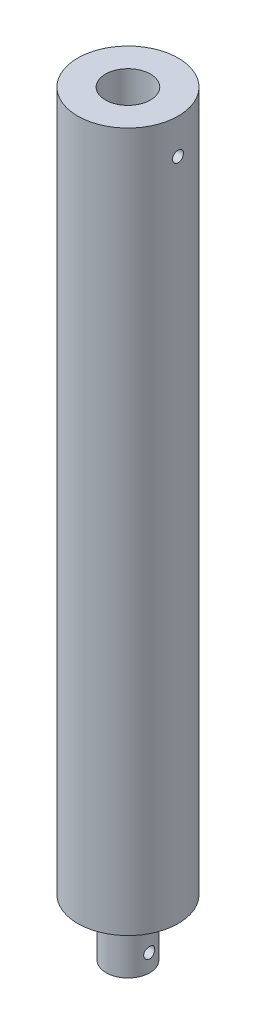
ISO-10303-21;
HEADER;
FILE_DESCRIPTION(('STEP AP214'),'2;1');
FILE_NAME('part.step','',(''),(''),'','','');
FILE_SCHEMA(('AUTOMOTIVE_DESIGN { 1 0 10303 214 1 1 1 1 }'));
ENDSEC;
DATA;
#1=APPLICATION_CONTEXT('core data for automotive mechanical design processes');
#2=APPLICATION_PROTOCOL_DEFINITION('international standard','automotive_design',2000,#1);
#3=PRODUCT_CONTEXT('',#1,'mechanical');
#4=PRODUCT('Part','Part','',(#3));
#5=PRODUCT_RELATED_PRODUCT_CATEGORY('part','',(#4));
#6=PRODUCT_DEFINITION_FORMATION('','',#4);
#7=PRODUCT_DEFINITION_CONTEXT('part definition',#1,'design');
#8=PRODUCT_DEFINITION('design','',#6,#7);
#9=PRODUCT_DEFINITION_SHAPE('','',#8);
#10=(LENGTH_UNIT() NAMED_UNIT(*) SI_UNIT(.MILLI.,.METRE.));
#11=(NAMED_UNIT(*) PLANE_ANGLE_UNIT() SI_UNIT($,.RADIAN.));
#12=(NAMED_UNIT(*) SI_UNIT($,.STERADIAN.) SOLID_ANGLE_UNIT());
#13=UNCERTAINTY_MEASURE_WITH_UNIT(LENGTH_MEASURE(1.E-05),#10,'distance_accuracy_value','');
#14=(GEOMETRIC_REPRESENTATION_CONTEXT(3) GLOBAL_UNCERTAINTY_ASSIGNED_CONTEXT((#13)) GLOBAL_UNIT_ASSIGNED_CONTEXT((#10,
#11,#12)) REPRESENTATION_CONTEXT('',''));
#15=CARTESIAN_POINT('',(0.,0.,0.));
#16=DIRECTION('',(0.,0.,1.));
#17=DIRECTION('',(1.,0.,0.));
#18=AXIS2_PLACEMENT_3D('',#15,#16,#17);
#19=CARTESIAN_POINT('',(0.,219.71,0.));
#20=DIRECTION('',(0.,-1.,0.));
#21=DIRECTION('',(0.,0.,-1.));
#22=AXIS2_PLACEMENT_3D('',#19,#20,#21);
#23=CYLINDRICAL_SURFACE('',#22,6.35);
#24=CARTESIAN_POINT('',(0.,16.51,0.));
#25=DIRECTION('',(0.,1.,0.));
#26=DIRECTION('',(0.,0.,1.));
#27=AXIS2_PLACEMENT_3D('',#24,#25,#26);
#28=CIRCLE('',#27,6.35);
#29=CARTESIAN_POINT('',(0.,16.51,6.35));
#30=VERTEX_POINT('',#29);
#31=EDGE_CURVE('E69',#30,#30,#28,.T.);
#32=ORIENTED_EDGE('',*,*,#31,.F.);
#33=EDGE_LOOP('',(#32));
#34=FACE_BOUND('',#33,.T.);
#35=CARTESIAN_POINT('',(0.,207.01,0.));
#36=DIRECTION('',(0.,1.,0.));
#37=DIRECTION('',(0.,0.,1.));
#38=AXIS2_PLACEMENT_3D('',#35,#36,#37);
#39=CIRCLE('',#38,6.35);
#40=CARTESIAN_POINT('',(0.,207.01,6.35));
#41=VERTEX_POINT('',#40);
#42=EDGE_CURVE('E58',#41,#41,#39,.T.);
#43=ORIENTED_EDGE('',*,*,#42,.T.);
#44=EDGE_LOOP('',(#43));
#45=FACE_BOUND('',#44,.T.);
#46=ADVANCED_FACE('F53',(#34,#45),#23,.F.);
#47=CARTESIAN_POINT('',(0.,219.71,0.));
#48=DIRECTION('',(0.,1.,0.));
#49=DIRECTION('',(0.,0.,1.));
#50=AXIS2_PLACEMENT_3D('',#47,#48,#49);
#51=PLANE('',#50);
#52=CARTESIAN_POINT('',(0.,219.71,0.));
#53=DIRECTION('',(0.,1.,0.));
#54=DIRECTION('',(0.,0.,1.));
#55=AXIS2_PLACEMENT_3D('',#52,#53,#54);
#56=CIRCLE('',#55,6.5405);
#57=CARTESIAN_POINT('',(0.,219.71,6.5405));
#58=VERTEX_POINT('',#57);
#59=EDGE_CURVE('E101',#58,#58,#56,.T.);
#60=ORIENTED_EDGE('',*,*,#59,.F.);
#61=EDGE_LOOP('',(#60));
#62=FACE_BOUND('',#61,.T.);
#63=CARTESIAN_POINT('',(0.,219.71,0.));
#64=DIRECTION('',(0.,1.,0.));
#65=DIRECTION('',(0.,0.,1.));
#66=AXIS2_PLACEMENT_3D('',#63,#64,#65);
#67=CIRCLE('',#66,14.605);
#68=CARTESIAN_POINT('',(0.,219.71,14.605));
#69=VERTEX_POINT('',#68);
#70=EDGE_CURVE('E11',#69,#69,#67,.T.);
#71=ORIENTED_EDGE('',*,*,#70,.T.);
#72=EDGE_LOOP('',(#71));
#73=FACE_BOUND('',#72,.T.);
#74=ADVANCED_FACE('F127',(#62,#73),#51,.T.);
#75=CARTESIAN_POINT('',(0.,16.51,0.));
#76=DIRECTION('',(0.,1.,0.));
#77=DIRECTION('',(0.,0.,1.));
#78=AXIS2_PLACEMENT_3D('',#75,#76,#77);
#79=PLANE('',#78);
#80=CARTESIAN_POINT('',(0.,16.51,0.));
#81=DIRECTION('',(0.,1.,0.));
#82=DIRECTION('',(0.,0.,1.));
#83=AXIS2_PLACEMENT_3D('',#80,#81,#82);
#84=CIRCLE('',#83,14.605);
#85=CARTESIAN_POINT('',(0.,16.51,14.605));
#86=VERTEX_POINT('',#85);
#87=EDGE_CURVE('E63',#86,#86,#84,.T.);
#88=ORIENTED_EDGE('',*,*,#87,.F.);
#89=EDGE_LOOP('',(#88));
#90=FACE_BOUND('',#89,.T.);
#91=ORIENTED_EDGE('',*,*,#31,.T.);
#92=EDGE_LOOP('',(#91));
#93=FACE_BOUND('',#92,.T.);
#94=ADVANCED_FACE('F123',(#90,#93),#79,.F.);
#95=CARTESIAN_POINT('',(0.,219.71,0.));
#96=DIRECTION('',(0.,-1.,0.));
#97=DIRECTION('',(0.,0.,-1.));
#98=AXIS2_PLACEMENT_3D('',#95,#96,#97);
#99=CYLINDRICAL_SURFACE('',#98,14.605);
#100=CARTESIAN_POINT('',(-14.5184664737706,209.55,-1.5875));
#101=CARTESIAN_POINT('',(-14.5184675998793,209.638887521639,-1.58749617103011));
#102=CARTESIAN_POINT('',(-14.5192915810766,209.727832779356,-1.58000933733849));
#103=CARTESIAN_POINT('',(-14.5224977657679,209.903254251712,-1.55025767880726));
#104=CARTESIAN_POINT('',(-14.5248816577369,209.989727684829,-1.52797684029079));
#105=CARTESIAN_POINT('',(-14.5309345224597,210.157639919113,-1.46929627189921));
#106=CARTESIAN_POINT('',(-14.5346026859705,210.23908185279,-1.43290543144579));
#107=CARTESIAN_POINT('',(-14.542809795843,210.394685284947,-1.34705560548717));
#108=CARTESIAN_POINT('',(-14.5473485770179,210.46884816049,-1.29759909832839));
#109=CARTESIAN_POINT('',(-14.55680721685,210.608121644079,-1.18679529511107));
#110=CARTESIAN_POINT('',(-14.561728458915,210.673196758916,-1.1254034998527));
#111=CARTESIAN_POINT('',(-14.5713850058503,210.792141514,-0.99256719274802));
#112=CARTESIAN_POINT('',(-14.5761203019701,210.846010627411,-0.921122208528099));
#113=CARTESIAN_POINT('',(-14.584885274292,210.941138656497,-0.769988010457059));
#114=CARTESIAN_POINT('',(-14.5889131672273,210.982365893287,-0.690278744826258));
#115=CARTESIAN_POINT('',(-14.5957943877229,211.050837145363,-0.525017488231168));
#116=CARTESIAN_POINT('',(-14.5986477487263,211.078081558793,-0.439465663705541));
#117=CARTESIAN_POINT('',(-14.6028486855217,211.117708966308,-0.26530816602213));
#118=CARTESIAN_POINT('',(-14.6042021952098,211.130150539723,-0.176715967283585));
#119=CARTESIAN_POINT('',(-14.6052711357852,211.140000446269,0.00130865260957029));
#120=CARTESIAN_POINT('',(-14.6049866162516,211.137409234405,0.0907410482517101));
#121=CARTESIAN_POINT('',(-14.602816394112,211.117314480232,0.267509453516736));
#122=CARTESIAN_POINT('',(-14.6009374553764,211.099873930969,0.354852718755758));
#123=CARTESIAN_POINT('',(-14.5957972349109,211.050673818854,0.52536510999851));
#124=CARTESIAN_POINT('',(-14.5925359324669,211.018914041435,0.608534173432904));
#125=CARTESIAN_POINT('',(-14.5849859179609,210.941908621576,0.768534715608067));
#126=CARTESIAN_POINT('',(-14.580695100976,210.896635302749,0.845352770841787));
#127=CARTESIAN_POINT('',(-14.5715670730655,210.793908049564,0.990324254080595));
#128=CARTESIAN_POINT('',(-14.5667298431935,210.736453692777,1.05847738146227));
#129=CARTESIAN_POINT('',(-14.557021832686,210.610641473295,1.18455371997678));
#130=CARTESIAN_POINT('',(-14.5521510078813,210.542228778665,1.24242222449574));
#131=CARTESIAN_POINT('',(-14.54294964144,210.39663140825,1.34586257686987));
#132=CARTESIAN_POINT('',(-14.5386191008396,210.319446715641,1.39143440114196));
#133=CARTESIAN_POINT('',(-14.5309883999937,210.158452137161,1.4689886011128));
#134=CARTESIAN_POINT('',(-14.5276885205374,210.074640453638,1.50096727440254));
#135=CARTESIAN_POINT('',(-14.5224984822577,209.902793238652,1.55038244591504));
#136=CARTESIAN_POINT('',(-14.5206082724931,209.814757859944,1.56781946963146));
#137=CARTESIAN_POINT('',(-14.5184605924623,209.637443455129,1.58758532851814));
#138=CARTESIAN_POINT('',(-14.5181948354549,209.548173073287,1.58999084458684));
#139=CARTESIAN_POINT('',(-14.5193042695985,209.370500534158,1.57982709014843));
#140=CARTESIAN_POINT('',(-14.5206794344695,209.28209836299,1.56725805946513));
#141=CARTESIAN_POINT('',(-14.5249082214811,209.10889719373,1.52756628881656));
#142=CARTESIAN_POINT('',(-14.5277581311357,209.024089723732,1.5004800879254));
#143=CARTESIAN_POINT('',(-14.5346122874711,208.860221443286,1.43256025639189));
#144=CARTESIAN_POINT('',(-14.5386165652124,208.78116078754,1.39172625583298));
#145=CARTESIAN_POINT('',(-14.5473482742757,208.630681695317,1.29727901083029));
#146=CARTESIAN_POINT('',(-14.5520785441031,208.559295211958,1.24361512329799));
#147=CARTESIAN_POINT('',(-14.5617200949785,208.426515536306,1.12510368818383));
#148=CARTESIAN_POINT('',(-14.5666313813248,208.36512263681,1.06025581304124));
#149=CARTESIAN_POINT('',(-14.5761067520141,208.253806819914,0.920883783286582));
#150=CARTESIAN_POINT('',(-14.5806692627852,208.203934044084,0.846319458816616));
#151=CARTESIAN_POINT('',(-14.5889099129678,208.117419830978,0.689828552404357));
#152=CARTESIAN_POINT('',(-14.5925880663857,208.080778184144,0.607902087091386));
#153=CARTESIAN_POINT('',(-14.5986385115443,208.02185061699,0.439184791888035));
#154=CARTESIAN_POINT('',(-14.6010135180575,207.999534835777,0.352404492790618));
#155=CARTESIAN_POINT('',(-14.6042012566077,207.969795102767,0.176301442814347));
#156=CARTESIAN_POINT('',(-14.6050140410925,207.96237065103,0.0869787773914742));
#157=CARTESIAN_POINT('',(-14.6049856599693,207.962632098322,-0.0911819181183822));
#158=CARTESIAN_POINT('',(-14.6041529956842,207.970240329941,-0.180020073683433));
#159=CARTESIAN_POINT('',(-14.6009440800001,208.000187782436,-0.355147937504436));
#160=CARTESIAN_POINT('',(-14.598567828036,208.022527008704,-0.441437644827324));
#161=CARTESIAN_POINT('',(-14.5925378101494,208.081279842982,-0.609015408924656));
#162=CARTESIAN_POINT('',(-14.5888842940992,208.117690698295,-0.690304440330071));
#163=CARTESIAN_POINT('',(-14.5807061313275,208.203545082923,-0.845629938613154));
#164=CARTESIAN_POINT('',(-14.5761814846426,208.252988611694,-0.919666405793615));
#165=CARTESIAN_POINT('',(-14.5667394117584,208.363795053645,-1.05878294429476));
#166=CARTESIAN_POINT('',(-14.5618201496834,208.42521583783,-1.12381679824635));
#167=CARTESIAN_POINT('',(-14.5521585816556,208.55811636505,-1.2426874668208));
#168=CARTESIAN_POINT('',(-14.5474163182489,208.629598507127,-1.29652160335967));
#169=CARTESIAN_POINT('',(-14.5386307131865,208.780828488436,-1.39159449332224));
#170=CARTESIAN_POINT('',(-14.5345894794341,208.860600141349,-1.43279553634583));
#171=CARTESIAN_POINT('',(-14.5276884225431,209.02592474979,-1.50116138037467));
#172=CARTESIAN_POINT('',(-14.5248272828866,209.11147113829,-1.5283418313459));
#173=CARTESIAN_POINT('',(-14.521323307398,209.256240851665,-1.56120374825235));
#174=CARTESIAN_POINT('',(-14.5202571468558,209.314542344085,-1.57105114201916));
#175=CARTESIAN_POINT('',(-14.5188283577012,209.431887394644,-1.5842005231171));
#176=CARTESIAN_POINT('',(-14.5184657254296,209.490930948922,-1.58750254449234));
#177=CARTESIAN_POINT('',(-14.5184664737706,209.55,-1.5875));
#178=B_SPLINE_CURVE_WITH_KNOTS('',3,(#100,#101,#102,#103,#104,#105,#106,#107,#108,#109,#110,
#111,#112,#113,#114,#115,#116,#117,#118,#119,#120,#121,#122,#123,#124,#125,#126,#127,#128,#129,
#130,#131,#132,#133,#134,#135,#136,#137,#138,#139,#140,#141,#142,#143,#144,#145,#146,#147,#148,
#149,#150,#151,#152,#153,#154,#155,#156,#157,#158,#159,#160,#161,#162,#163,#164,#165,#166,#167,
#168,#169,#170,#171,#172,#173,#174,#175,#176,#177),.UNSPECIFIED.,.T.,.F.,(4,2,2,2,2,2,2,2,2,2,2,
2,2,2,2,2,2,2,2,2,2,2,2,2,2,2,2,2,2,2,2,2,2,2,2,2,2,2,4),(0.,0.266446830712627,
0.533182546320062,0.799750488484646,1.06626790326574,1.33379874049426,1.60134215251234,
1.8695506153514,2.13775144084305,2.40488734623244,2.67201516612435,2.93801540493284,
3.20401962977065,3.47057242641525,3.73713446839447,4.00507454565817,4.27301513678461,
4.54102866103599,4.80903249962478,5.07566803460735,5.34229929936453,5.60826259513497,
5.87423304783905,6.14127121549871,6.40831720559882,6.67650449231114,6.94468753121167,
7.21230973751576,7.4799229588938,7.7461571530428,8.01239144466702,8.27857368179043,
8.5447559078008,8.81225763486746,9.07982325379274,9.34817996344659,9.61623647814001,
9.79330118896204,9.9703649788239),.UNSPECIFIED.);
#179=CARTESIAN_POINT('',(-14.5184664737706,209.55,-1.5875));
#180=VERTEX_POINT('',#179);
#181=EDGE_CURVE('E111',#180,#180,#178,.T.);
#182=ORIENTED_EDGE('',*,*,#181,.T.);
#183=EDGE_LOOP('',(#182));
#184=FACE_BOUND('',#183,.T.);
#185=CARTESIAN_POINT('',(14.5184664737706,209.55,-1.5875));
#186=CARTESIAN_POINT('',(14.5184675998793,209.461112478361,-1.58749617103011));
#187=CARTESIAN_POINT('',(14.5192915810766,209.372167220644,-1.58000933733849));
#188=CARTESIAN_POINT('',(14.5224977657679,209.196745748288,-1.55025767880726));
#189=CARTESIAN_POINT('',(14.5248816577369,209.110272315171,-1.52797684029079));
#190=CARTESIAN_POINT('',(14.5309345224597,208.942360080887,-1.46929627189921));
#191=CARTESIAN_POINT('',(14.5346026859705,208.86091814721,-1.43290543144579));
#192=CARTESIAN_POINT('',(14.542809795843,208.705314715053,-1.34705560548717));
#193=CARTESIAN_POINT('',(14.5473485770179,208.63115183951,-1.29759909832839));
#194=CARTESIAN_POINT('',(14.55680721685,208.491878355921,-1.18679529511107));
#195=CARTESIAN_POINT('',(14.561728458915,208.426803241084,-1.1254034998527));
#196=CARTESIAN_POINT('',(14.5713850058503,208.307858486,-0.99256719274802));
#197=CARTESIAN_POINT('',(14.5761203019701,208.253989372589,-0.921122208528099));
#198=CARTESIAN_POINT('',(14.584885274292,208.158861343503,-0.769988010457059));
#199=CARTESIAN_POINT('',(14.5889131672273,208.117634106713,-0.690278744826258));
#200=CARTESIAN_POINT('',(14.5957943877229,208.049162854637,-0.525017488231168));
#201=CARTESIAN_POINT('',(14.5986477487263,208.021918441207,-0.439465663705541));
#202=CARTESIAN_POINT('',(14.6028486855217,207.982291033692,-0.26530816602213));
#203=CARTESIAN_POINT('',(14.6042021952098,207.969849460277,-0.176715967283585));
#204=CARTESIAN_POINT('',(14.6052711357852,207.959999553731,0.00130865260957025));
#205=CARTESIAN_POINT('',(14.6049866162516,207.962590765595,0.0907410482517099));
#206=CARTESIAN_POINT('',(14.602816394112,207.982685519768,0.267509453516736));
#207=CARTESIAN_POINT('',(14.6009374553764,208.000126069031,0.354852718755758));
#208=CARTESIAN_POINT('',(14.5957972349109,208.049326181146,0.525365109998509));
#209=CARTESIAN_POINT('',(14.5925359324669,208.081085958565,0.608534173432901));
#210=CARTESIAN_POINT('',(14.5849859179609,208.158091378424,0.768534715608062));
#211=CARTESIAN_POINT('',(14.580695100976,208.203364697251,0.845352770841781));
#212=CARTESIAN_POINT('',(14.5715670730655,208.306091950436,0.99032425408059));
#213=CARTESIAN_POINT('',(14.5667298431935,208.363546307223,1.05847738146227));
#214=CARTESIAN_POINT('',(14.557021832686,208.489358526705,1.18455371997678));
#215=CARTESIAN_POINT('',(14.5521510078813,208.557771221335,1.24242222449574));
#216=CARTESIAN_POINT('',(14.54294964144,208.70336859175,1.34586257686987));
#217=CARTESIAN_POINT('',(14.5386191008396,208.780553284359,1.39143440114196));
#218=CARTESIAN_POINT('',(14.5309883999937,208.941547862839,1.4689886011128));
#219=CARTESIAN_POINT('',(14.5276885205374,209.025359546362,1.50096727440254));
#220=CARTESIAN_POINT('',(14.5224984822577,209.197206761348,1.55038244591504));
#221=CARTESIAN_POINT('',(14.5206082724931,209.285242140056,1.56781946963146));
#222=CARTESIAN_POINT('',(14.5184605924623,209.462556544871,1.58758532851814));
#223=CARTESIAN_POINT('',(14.5181948354549,209.551826926713,1.58999084458684));
#224=CARTESIAN_POINT('',(14.5193042695985,209.729499465842,1.57982709014843));
#225=CARTESIAN_POINT('',(14.5206794344695,209.81790163701,1.56725805946513));
#226=CARTESIAN_POINT('',(14.5249082214811,209.99110280627,1.52756628881656));
#227=CARTESIAN_POINT('',(14.5277581311357,210.075910276268,1.5004800879254));
#228=CARTESIAN_POINT('',(14.5346122874711,210.239778556714,1.43256025639189));
#229=CARTESIAN_POINT('',(14.5386165652124,210.31883921246,1.39172625583298));
#230=CARTESIAN_POINT('',(14.5473482742757,210.469318304683,1.29727901083029));
#231=CARTESIAN_POINT('',(14.5520785441031,210.540704788042,1.24361512329799));
#232=CARTESIAN_POINT('',(14.5617200949785,210.673484463694,1.12510368818383));
#233=CARTESIAN_POINT('',(14.5666313813248,210.73487736319,1.06025581304124));
#234=CARTESIAN_POINT('',(14.5761067520141,210.846193180086,0.920883783286582));
#235=CARTESIAN_POINT('',(14.5806692627852,210.896065955916,0.846319458816616));
#236=CARTESIAN_POINT('',(14.5889099129678,210.982580169022,0.689828552404357));
#237=CARTESIAN_POINT('',(14.5925880663857,211.019221815856,0.607902087091386));
#238=CARTESIAN_POINT('',(14.5986385115443,211.07814938301,0.439184791888035));
#239=CARTESIAN_POINT('',(14.6010135180575,211.100465164223,0.352404492790618));
#240=CARTESIAN_POINT('',(14.6042012566077,211.130204897233,0.176301442814347));
#241=CARTESIAN_POINT('',(14.6050140410925,211.13762934897,0.0869787773914742));
#242=CARTESIAN_POINT('',(14.6049856599693,211.137367901678,-0.0911819181183806));
#243=CARTESIAN_POINT('',(14.6041529956842,211.129759670059,-0.18002007368343));
#244=CARTESIAN_POINT('',(14.6009440800001,211.099812217564,-0.355147937504433));
#245=CARTESIAN_POINT('',(14.598567828036,211.077472991296,-0.441437644827323));
#246=CARTESIAN_POINT('',(14.5925378101494,211.018720157018,-0.609015408924656));
#247=CARTESIAN_POINT('',(14.5888842940992,210.982309301705,-0.690304440330071));
#248=CARTESIAN_POINT('',(14.5807061313275,210.896454917077,-0.845629938613154));
#249=CARTESIAN_POINT('',(14.5761814846426,210.847011388306,-0.919666405793615));
#250=CARTESIAN_POINT('',(14.5667394117584,210.736204946355,-1.05878294429476));
#251=CARTESIAN_POINT('',(14.5618201496834,210.67478416217,-1.12381679824635));
#252=CARTESIAN_POINT('',(14.5521585816556,210.54188363495,-1.2426874668208));
#253=CARTESIAN_POINT('',(14.5474163182489,210.470401492873,-1.29652160335967));
#254=CARTESIAN_POINT('',(14.5386307131865,210.319171511564,-1.39159449332224));
#255=CARTESIAN_POINT('',(14.5345894794341,210.239399858651,-1.43279553634583));
#256=CARTESIAN_POINT('',(14.5276884225431,210.07407525021,-1.50116138037467));
#257=CARTESIAN_POINT('',(14.5248272828866,209.98852886171,-1.5283418313459));
#258=CARTESIAN_POINT('',(14.521323307398,209.843759148335,-1.56120374825235));
#259=CARTESIAN_POINT('',(14.5202571468558,209.785457655915,-1.57105114201916));
#260=CARTESIAN_POINT('',(14.5188283577012,209.668112605356,-1.5842005231171));
#261=CARTESIAN_POINT('',(14.5184657254296,209.609069051078,-1.58750254449234));
#262=CARTESIAN_POINT('',(14.5184664737706,209.55,-1.5875));
#263=B_SPLINE_CURVE_WITH_KNOTS('',3,(#185,#186,#187,#188,#189,#190,#191,#192,#193,#194,#195,
#196,#197,#198,#199,#200,#201,#202,#203,#204,#205,#206,#207,#208,#209,#210,#211,#212,#213,#214,
#215,#216,#217,#218,#219,#220,#221,#222,#223,#224,#225,#226,#227,#228,#229,#230,#231,#232,#233,
#234,#235,#236,#237,#238,#239,#240,#241,#242,#243,#244,#245,#246,#247,#248,#249,#250,#251,#252,
#253,#254,#255,#256,#257,#258,#259,#260,#261,#262),.UNSPECIFIED.,.T.,.F.,(4,2,2,2,2,2,2,2,2,2,2,
2,2,2,2,2,2,2,2,2,2,2,2,2,2,2,2,2,2,2,2,2,2,2,2,2,2,2,4),(0.,0.266446830712627,
0.533182546320062,0.799750488484646,1.06626790326574,1.33379874049426,1.60134215251234,
1.8695506153514,2.13775144084305,2.40488734623244,2.67201516612435,2.93801540493284,
3.20401962977065,3.47057242641522,3.73713446839447,4.00507454565818,4.27301513678462,
4.54102866103599,4.80903249962478,5.07566803460735,5.34229929936454,5.60826259513498,
5.87423304783906,6.14127121549872,6.40831720559882,6.67650449231114,6.94468753121167,
7.21230973751577,7.47992295889381,7.7461571530428,8.01239144466703,8.27857368179043,
8.54475590780081,8.81225763486746,9.07982325379274,9.3481799634466,9.61623647814002,
9.79330118896205,9.9703649788239),.UNSPECIFIED.);
#264=CARTESIAN_POINT('',(14.5184664737706,209.55,-1.5875));
#265=VERTEX_POINT('',#264);
#266=EDGE_CURVE('E105',#265,#265,#263,.T.);
#267=ORIENTED_EDGE('',*,*,#266,.T.);
#268=EDGE_LOOP('',(#267));
#269=FACE_BOUND('',#268,.T.);
#270=ORIENTED_EDGE('',*,*,#70,.F.);
#271=EDGE_LOOP('',(#270));
#272=FACE_BOUND('',#271,.T.);
#273=ORIENTED_EDGE('',*,*,#87,.T.);
#274=EDGE_LOOP('',(#273));
#275=FACE_BOUND('',#274,.T.);
#276=ADVANCED_FACE('F55',(#184,#269,#272,#275),#99,.T.);
#277=CARTESIAN_POINT('',(-63.5,209.55,0.));
#278=DIRECTION('',(1.,0.,0.));
#279=DIRECTION('',(0.,0.,-1.));
#280=AXIS2_PLACEMENT_3D('',#277,#278,#279);
#281=CYLINDRICAL_SURFACE('',#280,1.5875);
#282=CARTESIAN_POINT('',(6.34491796637277,209.55,-1.5875));
#283=CARTESIAN_POINT('',(6.34491968426215,209.462250418049,-1.58749736582176));
#284=CARTESIAN_POINT('',(6.34675818545379,209.374471109173,-1.58019964378954));
#285=CARTESIAN_POINT('',(6.35389606992141,209.201427245727,-1.55124450799291));
#286=CARTESIAN_POINT('',(6.35919758521759,209.116164274171,-1.52957824804809));
#287=CARTESIAN_POINT('',(6.3726264991804,208.950681085134,-1.47262369396549));
#288=CARTESIAN_POINT('',(6.38075038324258,208.870454741727,-1.43735233582011));
#289=CARTESIAN_POINT('',(6.39890434246095,208.717050991301,-1.35423969965635));
#290=CARTESIAN_POINT('',(6.40893446978645,208.643873777284,-1.30639807760619));
#291=CARTESIAN_POINT('',(6.43000370261571,208.505126662975,-1.19844290464628));
#292=CARTESIAN_POINT('',(6.44105816656693,208.439724576003,-1.13811663163123));
#293=CARTESIAN_POINT('',(6.46279699070492,208.319860520756,-1.00736305385818));
#294=CARTESIAN_POINT('',(6.47348131771514,208.265399531077,-0.936934846525218));
#295=CARTESIAN_POINT('',(6.49344532758343,208.168282560192,-0.78683286056766));
#296=CARTESIAN_POINT('',(6.50270477206622,208.125790602063,-0.707050033574555));
#297=CARTESIAN_POINT('',(6.51860093249478,208.054883063351,-0.541212259787292));
#298=CARTESIAN_POINT('',(6.52523801253089,208.02646552853,-0.455158185662566));
#299=CARTESIAN_POINT('',(6.53503306133231,207.985048665064,-0.280969126711216));
#300=CARTESIAN_POINT('',(6.53825520282505,207.971764580376,-0.192905518803896));
#301=CARTESIAN_POINT('',(6.5410806397788,207.960098730191,-0.0157447093415772));
#302=CARTESIAN_POINT('',(6.54068444075277,207.961714883003,0.0733523460949865));
#303=CARTESIAN_POINT('',(6.53636591929678,207.979597048975,0.248078892603539));
#304=CARTESIAN_POINT('',(6.53251755422849,207.995555807196,0.333741930831281));
#305=CARTESIAN_POINT('',(6.52181275452451,208.041177340433,0.501136019120046));
#306=CARTESIAN_POINT('',(6.5149561650891,208.070840820682,0.582866866594928));
#307=CARTESIAN_POINT('',(6.49889076514058,208.143283935197,0.740896576460433));
#308=CARTESIAN_POINT('',(6.48966215073987,208.186174636569,0.817142428184156));
#309=CARTESIAN_POINT('',(6.46985647375277,208.283770805931,0.961463212608684));
#310=CARTESIAN_POINT('',(6.45927918882689,208.338478223038,1.02953679444236));
#311=CARTESIAN_POINT('',(6.43761262363987,208.459808438668,1.15741212795568));
#312=CARTESIAN_POINT('',(6.426517166513,208.526699877619,1.21695820454058));
#313=CARTESIAN_POINT('',(6.40531341859812,208.669635193443,1.3240425507407));
#314=CARTESIAN_POINT('',(6.39520516869336,208.745679449071,1.37158032318482));
#315=CARTESIAN_POINT('',(6.37709947532691,208.90524155167,1.45344979831044));
#316=CARTESIAN_POINT('',(6.36911139524974,208.988790439153,1.48772321635922));
#317=CARTESIAN_POINT('',(6.3562725519524,209.160704124048,1.54166028793874));
#318=CARTESIAN_POINT('',(6.35142116082779,209.249067953759,1.56132686559363));
#319=CARTESIAN_POINT('',(6.34553590723494,209.425740572472,1.58507460902303));
#320=CARTESIAN_POINT('',(6.3444098145259,209.513995724498,1.58953240019138));
#321=CARTESIAN_POINT('',(6.34585215226824,209.689988657294,1.58376434744586));
#322=CARTESIAN_POINT('',(6.34842026419646,209.777726482015,1.57353976948111));
#323=CARTESIAN_POINT('',(6.35687357701847,209.948817238501,1.53902664430697));
#324=CARTESIAN_POINT('',(6.36270771294604,210.032216575918,1.51495445136047));
#325=CARTESIAN_POINT('',(6.37698782066368,210.193796870487,1.45366790909821));
#326=CARTESIAN_POINT('',(6.38543408795636,210.271977236016,1.41645207281369));
#327=CARTESIAN_POINT('',(6.4041830163888,210.422504453987,1.32913633879426));
#328=CARTESIAN_POINT('',(6.41451729459556,210.494715697914,1.27880959655778));
#329=CARTESIAN_POINT('',(6.43579888617834,210.629806454802,1.16698987474897));
#330=CARTESIAN_POINT('',(6.44674629407724,210.692684523434,1.10549517017699));
#331=CARTESIAN_POINT('',(6.46833115043487,210.80883405371,0.971362469742996));
#332=CARTESIAN_POINT('',(6.47895532436956,210.861845877609,0.898497120590317));
#333=CARTESIAN_POINT('',(6.49843012874109,210.954879577056,0.744679012434444));
#334=CARTESIAN_POINT('',(6.50728085004527,210.994902118208,0.663726668107649));
#335=CARTESIAN_POINT('',(6.52215672044328,211.060484046306,0.496582797237446));
#336=CARTESIAN_POINT('',(6.5282016741717,211.086145078034,0.410432997983773));
#337=CARTESIAN_POINT('',(6.53687137211406,211.12258419647,0.234878786376294));
#338=CARTESIAN_POINT('',(6.53949673609309,211.13336498009,0.145474966800018));
#339=CARTESIAN_POINT('',(6.54100782326866,211.139593201496,-0.0316042892463484));
#340=CARTESIAN_POINT('',(6.53998725177793,211.135424841019,-0.11926562410486));
#341=CARTESIAN_POINT('',(6.53452721881309,211.112748064253,-0.292598866388573));
#342=CARTESIAN_POINT('',(6.53008784853861,211.094240030488,-0.378270826819382));
#343=CARTESIAN_POINT('',(6.51830173154418,211.043610310629,-0.544816635103991));
#344=CARTESIAN_POINT('',(6.51096906335874,211.01155449394,-0.625711568103395));
#345=CARTESIAN_POINT('',(6.49417098749026,210.934799619526,-0.781019842409194));
#346=CARTESIAN_POINT('',(6.48470532490558,210.890099050538,-0.855432407570926));
#347=CARTESIAN_POINT('',(6.4643954358641,210.788132029945,-0.997498614622161));
#348=CARTESIAN_POINT('',(6.45352471633866,210.730602508537,-1.06495965860988));
#349=CARTESIAN_POINT('',(6.43175445646956,210.60512631161,-1.18940092556251));
#350=CARTESIAN_POINT('',(6.42085490960104,210.537177035814,-1.24637852452788));
#351=CARTESIAN_POINT('',(6.40004729489635,210.391373925444,-1.34920016385311));
#352=CARTESIAN_POINT('',(6.39015966145724,210.313368969927,-1.39483435234641));
#353=CARTESIAN_POINT('',(6.37276546182382,210.150567131864,-1.47227278311196));
#354=CARTESIAN_POINT('',(6.36525709359829,210.06577545078,-1.50408749891636));
#355=CARTESIAN_POINT('',(6.35469845938995,209.909225552083,-1.54801336418728));
#356=CARTESIAN_POINT('',(6.35105754916475,209.838243137801,-1.56278956227978));
#357=CARTESIAN_POINT('',(6.34616668330979,209.694847162309,-1.58253359950715));
#358=CARTESIAN_POINT('',(6.34491654832501,209.622433708866,-1.58750217440693));
#359=CARTESIAN_POINT('',(6.34491796637277,209.55,-1.5875));
#360=B_SPLINE_CURVE_WITH_KNOTS('',3,(#282,#283,#284,#285,#286,#287,#288,#289,#290,#291,#292,
#293,#294,#295,#296,#297,#298,#299,#300,#301,#302,#303,#304,#305,#306,#307,#308,#309,#310,#311,
#312,#313,#314,#315,#316,#317,#318,#319,#320,#321,#322,#323,#324,#325,#326,#327,#328,#329,#330,
#331,#332,#333,#334,#335,#336,#337,#338,#339,#340,#341,#342,#343,#344,#345,#346,#347,#348,#349,
#350,#351,#352,#353,#354,#355,#356,#357,#358,#359),.UNSPECIFIED.,.T.,.F.,(4,2,2,2,2,2,2,2,2,2,2,
2,2,2,2,2,2,2,2,2,2,2,2,2,2,2,2,2,2,2,2,2,2,2,2,2,2,2,4),(0.,0.262982884455417,
0.526127828297949,0.788946253902493,1.05177187325518,1.31951149860587,1.58727506053874,
1.85854696084727,2.12978118438829,2.39582281056006,2.66182726902078,2.92226560284842,
3.18271734010051,3.44541851044345,3.70816304538045,3.97761827090134,4.24708465065347,
4.51772199622688,4.78830514865251,5.05213703166142,5.31594616781777,5.57574137420007,
5.83556598119524,6.10022504644799,6.36492502567164,6.63582770751486,6.90671650541965,
7.17566300176579,7.44456074756932,7.70659775158444,7.96862776576136,8.2293981844021,
8.49019978272768,8.75694282270458,9.0237525377354,9.29518189787864,9.56640518609354,
9.78350314217006,10.0005848110047),.UNSPECIFIED.);
#361=CARTESIAN_POINT('',(6.34491796637277,209.55,-1.5875));
#362=VERTEX_POINT('',#361);
#363=EDGE_CURVE('E81',#362,#362,#360,.T.);
#364=ORIENTED_EDGE('',*,*,#363,.T.);
#365=EDGE_LOOP('',(#364));
#366=FACE_BOUND('',#365,.T.);
#367=ORIENTED_EDGE('',*,*,#266,.F.);
#368=EDGE_LOOP('',(#367));
#369=FACE_BOUND('',#368,.T.);
#370=ADVANCED_FACE('F140',(#366,#369),#281,.F.);
#371=CARTESIAN_POINT('',(-6.34491796637277,209.55,-1.5875));
#372=CARTESIAN_POINT('',(-6.34491968426215,209.637749581951,-1.58749736582176));
#373=CARTESIAN_POINT('',(-6.34675818545379,209.725528890827,-1.58019964378954));
#374=CARTESIAN_POINT('',(-6.35389606992141,209.898572754273,-1.55124450799291));
#375=CARTESIAN_POINT('',(-6.35919758521759,209.983835725829,-1.52957824804809));
#376=CARTESIAN_POINT('',(-6.3726264991804,210.149318914866,-1.47262369396549));
#377=CARTESIAN_POINT('',(-6.38075038324258,210.229545258273,-1.43735233582011));
#378=CARTESIAN_POINT('',(-6.39890434246095,210.382949008699,-1.35423969965635));
#379=CARTESIAN_POINT('',(-6.40893446978645,210.456126222716,-1.30639807760619));
#380=CARTESIAN_POINT('',(-6.43000370261571,210.594873337025,-1.19844290464628));
#381=CARTESIAN_POINT('',(-6.44105816656693,210.660275423997,-1.13811663163123));
#382=CARTESIAN_POINT('',(-6.46279699070492,210.780139479244,-1.00736305385818));
#383=CARTESIAN_POINT('',(-6.47348131771514,210.834600468923,-0.936934846525218));
#384=CARTESIAN_POINT('',(-6.49344532758343,210.931717439808,-0.78683286056766));
#385=CARTESIAN_POINT('',(-6.50270477206622,210.974209397937,-0.707050033574555));
#386=CARTESIAN_POINT('',(-6.51860093249478,211.045116936649,-0.541212259787292));
#387=CARTESIAN_POINT('',(-6.52523801253089,211.07353447147,-0.455158185662566));
#388=CARTESIAN_POINT('',(-6.53503306133231,211.114951334936,-0.280969126711216));
#389=CARTESIAN_POINT('',(-6.53825520282505,211.128235419624,-0.192905518803896));
#390=CARTESIAN_POINT('',(-6.5410806397788,211.139901269809,-0.0157447093415772));
#391=CARTESIAN_POINT('',(-6.54068444075277,211.138285116997,0.0733523460949863));
#392=CARTESIAN_POINT('',(-6.53636591929678,211.120402951025,0.248078892603539));
#393=CARTESIAN_POINT('',(-6.53251755422849,211.104444192804,0.333741930831282));
#394=CARTESIAN_POINT('',(-6.52181275452451,211.058822659567,0.501136019120046));
#395=CARTESIAN_POINT('',(-6.5149561650891,211.029159179318,0.582866866594926));
#396=CARTESIAN_POINT('',(-6.49889076514058,210.956716064803,0.740896576460428));
#397=CARTESIAN_POINT('',(-6.48966215073987,210.913825363431,0.81714242818415));
#398=CARTESIAN_POINT('',(-6.46985647375277,210.816229194069,0.961463212608679));
#399=CARTESIAN_POINT('',(-6.45927918882689,210.761521776962,1.02953679444236));
#400=CARTESIAN_POINT('',(-6.43761262363987,210.640191561332,1.15741212795567));
#401=CARTESIAN_POINT('',(-6.426517166513,210.573300122381,1.21695820454058));
#402=CARTESIAN_POINT('',(-6.40531341859812,210.430364806557,1.3240425507407));
#403=CARTESIAN_POINT('',(-6.39520516869336,210.354320550929,1.37158032318482));
#404=CARTESIAN_POINT('',(-6.37709947532691,210.19475844833,1.45344979831044));
#405=CARTESIAN_POINT('',(-6.36911139524974,210.111209560847,1.48772321635922));
#406=CARTESIAN_POINT('',(-6.3562725519524,209.939295875952,1.54166028793874));
#407=CARTESIAN_POINT('',(-6.35142116082779,209.850932046241,1.56132686559363));
#408=CARTESIAN_POINT('',(-6.34553590723494,209.674259427528,1.58507460902303));
#409=CARTESIAN_POINT('',(-6.3444098145259,209.586004275502,1.58953240019138));
#410=CARTESIAN_POINT('',(-6.34585215226824,209.410011342706,1.58376434744586));
#411=CARTESIAN_POINT('',(-6.34842026419646,209.322273517985,1.57353976948111));
#412=CARTESIAN_POINT('',(-6.35687357701847,209.151182761499,1.53902664430697));
#413=CARTESIAN_POINT('',(-6.36270771294604,209.067783424082,1.51495445136046));
#414=CARTESIAN_POINT('',(-6.37698782066368,208.906203129513,1.4536679090982));
#415=CARTESIAN_POINT('',(-6.38543408795636,208.828022763984,1.41645207281368));
#416=CARTESIAN_POINT('',(-6.4041830163888,208.677495546013,1.32913633879426));
#417=CARTESIAN_POINT('',(-6.41451729459556,208.605284302086,1.27880959655778));
#418=CARTESIAN_POINT('',(-6.43579888617834,208.470193545198,1.16698987474897));
#419=CARTESIAN_POINT('',(-6.44674629407724,208.407315476566,1.10549517017699));
#420=CARTESIAN_POINT('',(-6.46833115043487,208.29116594629,0.971362469742996));
#421=CARTESIAN_POINT('',(-6.47895532436956,208.23815412239,0.898497120590317));
#422=CARTESIAN_POINT('',(-6.49843012874109,208.145120422944,0.744679012434444));
#423=CARTESIAN_POINT('',(-6.50728085004527,208.105097881792,0.663726668107649));
#424=CARTESIAN_POINT('',(-6.52215672044328,208.039515953694,0.496582797237444));
#425=CARTESIAN_POINT('',(-6.5282016741717,208.013854921966,0.410432997983769));
#426=CARTESIAN_POINT('',(-6.53687137211406,207.97741580353,0.23487878637629));
#427=CARTESIAN_POINT('',(-6.53949673609309,207.96663501991,0.145474966800016));
#428=CARTESIAN_POINT('',(-6.54100782326866,207.960406798504,-0.0316042892463483));
#429=CARTESIAN_POINT('',(-6.53998725177793,207.964575158981,-0.11926562410486));
#430=CARTESIAN_POINT('',(-6.53452721881309,207.987251935747,-0.292598866388573));
#431=CARTESIAN_POINT('',(-6.53008784853861,208.005759969512,-0.378270826819382));
#432=CARTESIAN_POINT('',(-6.51830173154418,208.056389689371,-0.544816635103991));
#433=CARTESIAN_POINT('',(-6.51096906335874,208.08844550606,-0.625711568103395));
#434=CARTESIAN_POINT('',(-6.49417098749026,208.165200380474,-0.781019842409194));
#435=CARTESIAN_POINT('',(-6.48470532490558,208.209900949462,-0.855432407570926));
#436=CARTESIAN_POINT('',(-6.4643954358641,208.311867970055,-0.997498614622161));
#437=CARTESIAN_POINT('',(-6.45352471633866,208.369397491463,-1.06495965860988));
#438=CARTESIAN_POINT('',(-6.43175445646956,208.49487368839,-1.18940092556251));
#439=CARTESIAN_POINT('',(-6.42085490960104,208.562822964186,-1.24637852452788));
#440=CARTESIAN_POINT('',(-6.40004729489635,208.708626074556,-1.34920016385311));
#441=CARTESIAN_POINT('',(-6.39015966145724,208.786631030073,-1.3948343523464));
#442=CARTESIAN_POINT('',(-6.37276546182382,208.949432868136,-1.47227278311195));
#443=CARTESIAN_POINT('',(-6.36525709359829,209.03422454922,-1.50408749891636));
#444=CARTESIAN_POINT('',(-6.35469845938995,209.190774447917,-1.54801336418728));
#445=CARTESIAN_POINT('',(-6.35105754916475,209.261756862199,-1.56278956227978));
#446=CARTESIAN_POINT('',(-6.34616668330979,209.405152837691,-1.58253359950715));
#447=CARTESIAN_POINT('',(-6.34491654832501,209.477566291134,-1.58750217440693));
#448=CARTESIAN_POINT('',(-6.34491796637277,209.55,-1.5875));
#449=B_SPLINE_CURVE_WITH_KNOTS('',3,(#371,#372,#373,#374,#375,#376,#377,#378,#379,#380,#381,
#382,#383,#384,#385,#386,#387,#388,#389,#390,#391,#392,#393,#394,#395,#396,#397,#398,#399,#400,
#401,#402,#403,#404,#405,#406,#407,#408,#409,#410,#411,#412,#413,#414,#415,#416,#417,#418,#419,
#420,#421,#422,#423,#424,#425,#426,#427,#428,#429,#430,#431,#432,#433,#434,#435,#436,#437,#438,
#439,#440,#441,#442,#443,#444,#445,#446,#447,#448),.UNSPECIFIED.,.T.,.F.,(4,2,2,2,2,2,2,2,2,2,2,
2,2,2,2,2,2,2,2,2,2,2,2,2,2,2,2,2,2,2,2,2,2,2,2,2,2,2,4),(0.,0.262982884455417,
0.526127828297949,0.788946253902493,1.05177187325518,1.31951149860587,1.58727506053874,
1.85854696084727,2.12978118438829,2.39582281056006,2.66182726902078,2.92226560284842,
3.18271734010051,3.44541851044343,3.70816304538045,3.97761827090134,4.24708465065348,
4.51772199622688,4.78830514865251,5.05213703166142,5.31594616781777,5.5757413742001,
5.83556598119525,6.10022504644799,6.36492502567164,6.63582770751486,6.90671650541965,
7.1756630017658,7.44456074756932,7.70659775158444,7.96862776576136,8.22939818440211,
8.49019978272768,8.75694282270458,9.0237525377354,9.29518189787861,9.56640518609354,
9.78350314217006,10.0005848110047),.UNSPECIFIED.);
#450=CARTESIAN_POINT('',(-6.34491796637277,209.55,-1.5875));
#451=VERTEX_POINT('',#450);
#452=EDGE_CURVE('E73',#451,#451,#449,.T.);
#453=ORIENTED_EDGE('',*,*,#452,.T.);
#454=EDGE_LOOP('',(#453));
#455=FACE_BOUND('',#454,.T.);
#456=ORIENTED_EDGE('',*,*,#181,.F.);
#457=EDGE_LOOP('',(#456));
#458=FACE_BOUND('',#457,.T.);
#459=ADVANCED_FACE('F83',(#455,#458),#281,.F.);
#460=CARTESIAN_POINT('',(0.,207.01,0.));
#461=DIRECTION('',(0.,1.,0.));
#462=DIRECTION('',(0.,0.,1.));
#463=AXIS2_PLACEMENT_3D('',#460,#461,#462);
#464=CYLINDRICAL_SURFACE('',#463,6.5405);
#465=ORIENTED_EDGE('',*,*,#59,.T.);
#466=EDGE_LOOP('',(#465));
#467=FACE_BOUND('',#466,.T.);
#468=ORIENTED_EDGE('',*,*,#452,.F.);
#469=EDGE_LOOP('',(#468));
#470=FACE_BOUND('',#469,.T.);
#471=CARTESIAN_POINT('',(0.,207.01,0.));
#472=DIRECTION('',(0.,1.,0.));
#473=DIRECTION('',(0.,0.,1.));
#474=AXIS2_PLACEMENT_3D('',#471,#472,#473);
#475=CIRCLE('',#474,6.5405);
#476=CARTESIAN_POINT('',(0.,207.01,6.5405));
#477=VERTEX_POINT('',#476);
#478=EDGE_CURVE('E82',#477,#477,#475,.T.);
#479=ORIENTED_EDGE('',*,*,#478,.F.);
#480=EDGE_LOOP('',(#479));
#481=FACE_BOUND('',#480,.T.);
#482=ORIENTED_EDGE('',*,*,#363,.F.);
#483=EDGE_LOOP('',(#482));
#484=FACE_BOUND('',#483,.T.);
#485=ADVANCED_FACE('F86',(#467,#470,#481,#484),#464,.F.);
#486=CARTESIAN_POINT('',(0.,207.01,0.));
#487=DIRECTION('',(0.,1.,0.));
#488=DIRECTION('',(0.,0.,1.));
#489=AXIS2_PLACEMENT_3D('',#486,#487,#488);
#490=PLANE('',#489);
#491=ORIENTED_EDGE('',*,*,#42,.F.);
#492=EDGE_LOOP('',(#491));
#493=FACE_BOUND('',#492,.T.);
#494=ORIENTED_EDGE('',*,*,#478,.T.);
#495=EDGE_LOOP('',(#494));
#496=FACE_BOUND('',#495,.T.);
#497=ADVANCED_FACE('F90',(#493,#496),#490,.T.);
#498=CLOSED_SHELL('',(#46,#74,#94,#276,#370,#459,#485,#497));
#499=MANIFOLD_SOLID_BREP('B2',#498);
#500=CARTESIAN_POINT('',(0.,19.05,0.));
#501=DIRECTION('',(0.,-1.,0.));
#502=DIRECTION('',(0.,0.,-1.));
#503=AXIS2_PLACEMENT_3D('',#500,#501,#502);
#504=CYLINDRICAL_SURFACE('',#503,6.35);
#505=CARTESIAN_POINT('',(-6.14836106210427,5.08,-1.5875));
#506=CARTESIAN_POINT('',(-6.1483627355417,5.16766222683713,-1.58749750990578));
#507=CARTESIAN_POINT('',(-6.15025634318835,5.25535201066053,-1.58021416589079));
#508=CARTESIAN_POINT('',(-6.15760682365713,5.42821341214051,-1.55131968466973));
#509=CARTESIAN_POINT('',(-6.16306577024852,5.51338353408739,-1.5297002087813));
#510=CARTESIAN_POINT('',(-6.17689090118439,5.67868024674877,-1.47287691176629));
#511=CARTESIAN_POINT('',(-6.18525333108409,5.7588131936699,-1.43769062718759));
#512=CARTESIAN_POINT('',(-6.20393851938293,5.91204739136285,-1.35478592470099));
#513=CARTESIAN_POINT('',(-6.21426136100349,5.98514834342094,-1.30706697473604));
#514=CARTESIAN_POINT('',(-6.23595854885813,6.1238521447415,-1.19932985134304));
#515=CARTESIAN_POINT('',(-6.24734969490624,6.18927743622228,-1.13908642369207));
#516=CARTESIAN_POINT('',(-6.26975425952214,6.30920848541882,-1.00849561070392));
#517=CARTESIAN_POINT('',(-6.28076764269657,6.36371322226981,-0.938147281804495));
#518=CARTESIAN_POINT('',(-6.30136163855569,6.46098242194586,-0.788127202685136));
#519=CARTESIAN_POINT('',(-6.31092011499376,6.50357245648253,-0.708339055883901));
#520=CARTESIAN_POINT('',(-6.32733565573,6.57466912403721,-0.542457122025904));
#521=CARTESIAN_POINT('',(-6.33419311857309,6.60317783496635,-0.456364267477882));
#522=CARTESIAN_POINT('',(-6.34431521868594,6.6447338749574,-0.282167811808892));
#523=CARTESIAN_POINT('',(-6.34764982591139,6.65808272414738,-0.1941402769136));
#524=CARTESIAN_POINT('',(-6.35059432258134,6.66988657083998,-0.0170363002318587));
#525=CARTESIAN_POINT('',(-6.35020476271407,6.6683437703531,0.0720399845316733));
#526=CARTESIAN_POINT('',(-6.34579690295494,6.65062497009116,0.246621692386165));
#527=CARTESIAN_POINT('',(-6.34185931486455,6.6347744335908,0.332162492266694));
#528=CARTESIAN_POINT('',(-6.33089181193282,6.5894132435192,0.499329467769227));
#529=CARTESIAN_POINT('',(-6.3238617324801,6.55990186278534,0.58095543475057));
#530=CARTESIAN_POINT('',(-6.30737568660069,6.48779336761371,0.738833141809118));
#531=CARTESIAN_POINT('',(-6.29789837506359,6.44508042663979,0.815029659254325));
#532=CARTESIAN_POINT('',(-6.27754588919127,6.34786914376118,0.959287550465525));
#533=CARTESIAN_POINT('',(-6.26667047179331,6.29336875146401,1.02734750569824));
#534=CARTESIAN_POINT('',(-6.24435958243645,6.17238494884119,1.15534128069737));
#535=CARTESIAN_POINT('',(-6.23291691898958,6.10561714335917,1.21500531553188));
#536=CARTESIAN_POINT('',(-6.21103052633108,5.96290401680194,1.32234999684129));
#537=CARTESIAN_POINT('',(-6.20058684382291,5.88695826702322,1.37003008322305));
#538=CARTESIAN_POINT('',(-6.18185515488097,5.72751582831541,1.45222615482337));
#539=CARTESIAN_POINT('',(-6.17357784665833,5.64398431125112,1.48667718756565));
#540=CARTESIAN_POINT('',(-6.16025336488873,5.47205822777145,1.54096342276019));
#541=CARTESIAN_POINT('',(-6.15520550014489,5.38366470637071,1.56080175290274));
#542=CARTESIAN_POINT('',(-6.14905651084854,5.20702571653282,1.58485182055239));
#543=CARTESIAN_POINT('',(-6.14785466574466,5.11883800123569,1.58946245093896));
#544=CARTESIAN_POINT('',(-6.1492596311046,4.94295307027287,1.58401828897737));
#545=CARTESIAN_POINT('',(-6.15186609096804,4.85525581020096,1.57396484663399));
#546=CARTESIAN_POINT('',(-6.16049747041146,4.68432244175376,1.53982766960042));
#547=CARTESIAN_POINT('',(-6.16646576098828,4.60103681862751,1.51597618335891));
#548=CARTESIAN_POINT('',(-6.18109456102061,4.43964602426418,1.45517748186084));
#549=CARTESIAN_POINT('',(-6.1897553893787,4.36154146799986,1.41822871529747));
#550=CARTESIAN_POINT('',(-6.20900547054222,4.21103978855423,1.33144937413971));
#551=CARTESIAN_POINT('',(-6.21962922065218,4.13878468657263,1.28138031368562));
#552=CARTESIAN_POINT('',(-6.2415234775054,4.00355538962114,1.17008321503345));
#553=CARTESIAN_POINT('',(-6.25279409032578,3.9405827229272,1.10885334300364));
#554=CARTESIAN_POINT('',(-6.2750535092507,3.82408998796744,0.975142069563253));
#555=CARTESIAN_POINT('',(-6.28602820809266,3.77084586028151,0.902417474643904));
#556=CARTESIAN_POINT('',(-6.30616732549721,3.67732572448596,0.748828008777798));
#557=CARTESIAN_POINT('',(-6.31533183847515,3.63704903995379,0.667963562720177));
#558=CARTESIAN_POINT('',(-6.33076023493829,3.57095676807476,0.500948645248106));
#559=CARTESIAN_POINT('',(-6.3370449206423,3.5450371794193,0.414841342381762));
#560=CARTESIAN_POINT('',(-6.34609661306326,3.50808268752366,0.239315244506108));
#561=CARTESIAN_POINT('',(-6.34886429864815,3.4970449117007,0.149897092002975));
#562=CARTESIAN_POINT('',(-6.35054243936488,3.49032895154884,-0.0271200982287792));
#563=CARTESIAN_POINT('',(-6.34955516472013,3.49424353681107,-0.114702950308576));
#564=CARTESIAN_POINT('',(-6.3440611062616,3.51638842582975,-0.287920900558398));
#565=CARTESIAN_POINT('',(-6.33955442711888,3.5346183038333,-0.373556056577156));
#566=CARTESIAN_POINT('',(-6.32754374655666,3.58465789888635,-0.540021519086144));
#567=CARTESIAN_POINT('',(-6.32005601147982,3.61639398213697,-0.620875210147366));
#568=CARTESIAN_POINT('',(-6.30287171149997,3.69247829419318,-0.77615582170333));
#569=CARTESIAN_POINT('',(-6.29317486818656,3.73682811286294,-0.850581930508268));
#570=CARTESIAN_POINT('',(-6.27232758869116,3.83812293397035,-0.992825561372939));
#571=CARTESIAN_POINT('',(-6.26114789401158,3.89534422686546,-1.06044204392718));
#572=CARTESIAN_POINT('',(-6.23872655372022,4.0202212775084,-1.18525134468062));
#573=CARTESIAN_POINT('',(-6.22748489312182,4.08787967680543,-1.24244151604575));
#574=CARTESIAN_POINT('',(-6.2059736792862,4.23322974504462,-1.34582221703577));
#575=CARTESIAN_POINT('',(-6.19572617421192,4.31108504591755,-1.3917876333714));
#576=CARTESIAN_POINT('',(-6.17766029436602,4.47366309025229,-1.46990894837737));
#577=CARTESIAN_POINT('',(-6.16984015341641,4.55838078369445,-1.50207489424355));
#578=CARTESIAN_POINT('',(-6.15873655124406,4.71579100627491,-1.54689576409763));
#579=CARTESIAN_POINT('',(-6.15487502513368,4.78773039845938,-1.56208915832016));
#580=CARTESIAN_POINT('',(-6.14968668754595,4.93310682953744,-1.58239188946006));
#581=CARTESIAN_POINT('',(-6.14835965985316,5.00654374013904,-1.58750208656584));
#582=CARTESIAN_POINT('',(-6.14836106210427,5.08,-1.5875));
#583=B_SPLINE_CURVE_WITH_KNOTS('',3,(#505,#506,#507,#508,#509,#510,#511,#512,#513,#514,#515,
#516,#517,#518,#519,#520,#521,#522,#523,#524,#525,#526,#527,#528,#529,#530,#531,#532,#533,#534,
#535,#536,#537,#538,#539,#540,#541,#542,#543,#544,#545,#546,#547,#548,#549,#550,#551,#552,#553,
#554,#555,#556,#557,#558,#559,#560,#561,#562,#563,#564,#565,#566,#567,#568,#569,#570,#571,#572,
#573,#574,#575,#576,#577,#578,#579,#580,#581,#582),.UNSPECIFIED.,.T.,.F.,(4,2,2,2,2,2,2,2,2,2,2,
2,2,2,2,2,2,2,2,2,2,2,2,2,2,2,2,2,2,2,2,2,2,2,2,2,2,2,4),(0.,0.262716925502447,
0.525586795807203,0.788118011750423,1.05066037489729,1.3184121091254,1.58618886139715,
1.85770200212679,2.12917506502904,2.39514856882045,2.66108274402923,2.92111596807481,
3.18116303520239,3.44355975151572,3.7060021477276,3.97554746273164,4.24510537311874,
4.51597034325335,4.78677732082263,5.0504316997369,5.31406180761714,5.57337852180846,
5.832725961026,6.09716107120565,6.36163966992003,6.63273585162977,6.90381788981916,
7.172909662324,7.44194948557239,7.70371488290935,7.96547249534383,8.22582096615416,
8.48620226643675,8.75282156329615,9.01950845044098,9.29117063075769,9.56263468067803,
9.78279620257604,10.002938941882),.UNSPECIFIED.);
#584=CARTESIAN_POINT('',(-6.14836106210427,5.08,-1.5875));
#585=VERTEX_POINT('',#584);
#586=EDGE_CURVE('E222',#585,#585,#583,.T.);
#587=ORIENTED_EDGE('',*,*,#586,.T.);
#588=EDGE_LOOP('',(#587));
#589=FACE_BOUND('',#588,.T.);
#590=CARTESIAN_POINT('',(6.14836106210428,5.08,-1.5875));
#591=CARTESIAN_POINT('',(6.14836273554171,4.99233777316287,-1.58749750990578));
#592=CARTESIAN_POINT('',(6.15025634318835,4.90464798933947,-1.58021416589079));
#593=CARTESIAN_POINT('',(6.15760682365712,4.73178658785949,-1.55131968466973));
#594=CARTESIAN_POINT('',(6.16306577024851,4.64661646591261,-1.5297002087813));
#595=CARTESIAN_POINT('',(6.17689090118439,4.48131975325123,-1.47287691176629));
#596=CARTESIAN_POINT('',(6.18525333108409,4.4011868063301,-1.43769062718759));
#597=CARTESIAN_POINT('',(6.20393851938293,4.24795260863715,-1.35478592470099));
#598=CARTESIAN_POINT('',(6.21426136100349,4.17485165657906,-1.30706697473604));
#599=CARTESIAN_POINT('',(6.23595854885813,4.0361478552585,-1.19932985134304));
#600=CARTESIAN_POINT('',(6.24734969490624,3.97072256377772,-1.13908642369207));
#601=CARTESIAN_POINT('',(6.26975425952214,3.85079151458118,-1.00849561070392));
#602=CARTESIAN_POINT('',(6.28076764269657,3.79628677773019,-0.938147281804495));
#603=CARTESIAN_POINT('',(6.30136163855569,3.69901757805414,-0.788127202685136));
#604=CARTESIAN_POINT('',(6.31092011499376,3.65642754351747,-0.708339055883901));
#605=CARTESIAN_POINT('',(6.32733565573,3.58533087596279,-0.542457122025904));
#606=CARTESIAN_POINT('',(6.33419311857309,3.55682216503365,-0.456364267477882));
#607=CARTESIAN_POINT('',(6.34431521868594,3.5152661250426,-0.282167811808892));
#608=CARTESIAN_POINT('',(6.34764982591139,3.50191727585262,-0.194140276913599));
#609=CARTESIAN_POINT('',(6.35059432258134,3.49011342916002,-0.0170363002318584));
#610=CARTESIAN_POINT('',(6.35020476271407,3.4916562296469,0.0720399845316736));
#611=CARTESIAN_POINT('',(6.34579690295494,3.50937502990884,0.246621692386165));
#612=CARTESIAN_POINT('',(6.34185931486455,3.5252255664092,0.332162492266694));
#613=CARTESIAN_POINT('',(6.33089181193282,3.5705867564808,0.499329467769227));
#614=CARTESIAN_POINT('',(6.3238617324801,3.60009813721466,0.58095543475057));
#615=CARTESIAN_POINT('',(6.30737568660069,3.67220663238629,0.738833141809118));
#616=CARTESIAN_POINT('',(6.29789837506359,3.71491957336021,0.815029659254326));
#617=CARTESIAN_POINT('',(6.27754588919127,3.81213085623882,0.959287550465526));
#618=CARTESIAN_POINT('',(6.26667047179331,3.86663124853599,1.02734750569824));
#619=CARTESIAN_POINT('',(6.24435958243645,3.98761505115881,1.15534128069737));
#620=CARTESIAN_POINT('',(6.23291691898958,4.05438285664084,1.21500531553188));
#621=CARTESIAN_POINT('',(6.21103052633108,4.19709598319806,1.32234999684129));
#622=CARTESIAN_POINT('',(6.20058684382291,4.27304173297679,1.37003008322305));
#623=CARTESIAN_POINT('',(6.18185515488097,4.43248417168459,1.45222615482337));
#624=CARTESIAN_POINT('',(6.17357784665833,4.51601568874888,1.48667718756565));
#625=CARTESIAN_POINT('',(6.16025336488873,4.68794177222855,1.54096342276019));
#626=CARTESIAN_POINT('',(6.15520550014489,4.77633529362929,1.56080175290274));
#627=CARTESIAN_POINT('',(6.14905651084854,4.95297428346718,1.58485182055239));
#628=CARTESIAN_POINT('',(6.14785466574466,5.04116199876431,1.58946245093896));
#629=CARTESIAN_POINT('',(6.1492596311046,5.21704692972713,1.58401828897737));
#630=CARTESIAN_POINT('',(6.15186609096804,5.30474418979904,1.57396484663399));
#631=CARTESIAN_POINT('',(6.16049747041146,5.47567755824624,1.53982766960041));
#632=CARTESIAN_POINT('',(6.16646576098828,5.55896318137249,1.51597618335891));
#633=CARTESIAN_POINT('',(6.18109456102061,5.72035397573582,1.45517748186084));
#634=CARTESIAN_POINT('',(6.1897553893787,5.79845853200014,1.41822871529747));
#635=CARTESIAN_POINT('',(6.20900547054222,5.94896021144577,1.33144937413971));
#636=CARTESIAN_POINT('',(6.21962922065218,6.02121531342737,1.28138031368562));
#637=CARTESIAN_POINT('',(6.2415234775054,6.15644461037886,1.17008321503345));
#638=CARTESIAN_POINT('',(6.25279409032578,6.2194172770728,1.10885334300364));
#639=CARTESIAN_POINT('',(6.2750535092507,6.33591001203256,0.975142069563252));
#640=CARTESIAN_POINT('',(6.28602820809266,6.3891541397185,0.902417474643903));
#641=CARTESIAN_POINT('',(6.30616732549721,6.48267427551404,0.748828008777798));
#642=CARTESIAN_POINT('',(6.31533183847515,6.52295096004621,0.667963562720176));
#643=CARTESIAN_POINT('',(6.33076023493829,6.58904323192524,0.500948645248106));
#644=CARTESIAN_POINT('',(6.3370449206423,6.6149628205807,0.414841342381762));
#645=CARTESIAN_POINT('',(6.34609661306326,6.65191731247635,0.239315244506107));
#646=CARTESIAN_POINT('',(6.34886429864815,6.6629550882993,0.149897092002974));
#647=CARTESIAN_POINT('',(6.35054243936488,6.66967104845116,-0.0271200982287805));
#648=CARTESIAN_POINT('',(6.34955516472013,6.66575646318893,-0.114702950308578));
#649=CARTESIAN_POINT('',(6.3440611062616,6.64361157417025,-0.287920900558399));
#650=CARTESIAN_POINT('',(6.33955442711888,6.6253816961667,-0.373556056577157));
#651=CARTESIAN_POINT('',(6.32754374655666,6.57534210111365,-0.540021519086145));
#652=CARTESIAN_POINT('',(6.32005601147982,6.54360601786303,-0.620875210147367));
#653=CARTESIAN_POINT('',(6.30287171149997,6.46752170580682,-0.776155821703331));
#654=CARTESIAN_POINT('',(6.29317486818656,6.42317188713706,-0.850581930508269));
#655=CARTESIAN_POINT('',(6.27232758869116,6.32187706602965,-0.99282556137294));
#656=CARTESIAN_POINT('',(6.26114789401158,6.26465577313454,-1.06044204392718));
#657=CARTESIAN_POINT('',(6.23872655372022,6.1397787224916,-1.18525134468062));
#658=CARTESIAN_POINT('',(6.22748489312182,6.07212032319457,-1.24244151604575));
#659=CARTESIAN_POINT('',(6.2059736792862,5.92677025495538,-1.34582221703577));
#660=CARTESIAN_POINT('',(6.19572617421192,5.84891495408245,-1.3917876333714));
#661=CARTESIAN_POINT('',(6.17766029436602,5.68633690974771,-1.46990894837737));
#662=CARTESIAN_POINT('',(6.16984015341641,5.60161921630555,-1.50207489424355));
#663=CARTESIAN_POINT('',(6.15873655124406,5.44420899372509,-1.54689576409763));
#664=CARTESIAN_POINT('',(6.15487502513368,5.37226960154062,-1.56208915832016));
#665=CARTESIAN_POINT('',(6.14968668754596,5.22689317046256,-1.58239188946006));
#666=CARTESIAN_POINT('',(6.14835965985317,5.15345625986097,-1.58750208656584));
#667=CARTESIAN_POINT('',(6.14836106210428,5.08,-1.5875));
#668=B_SPLINE_CURVE_WITH_KNOTS('',3,(#590,#591,#592,#593,#594,#595,#596,#597,#598,#599,#600,
#601,#602,#603,#604,#605,#606,#607,#608,#609,#610,#611,#612,#613,#614,#615,#616,#617,#618,#619,
#620,#621,#622,#623,#624,#625,#626,#627,#628,#629,#630,#631,#632,#633,#634,#635,#636,#637,#638,
#639,#640,#641,#642,#643,#644,#645,#646,#647,#648,#649,#650,#651,#652,#653,#654,#655,#656,#657,
#658,#659,#660,#661,#662,#663,#664,#665,#666,#667),.UNSPECIFIED.,.T.,.F.,(4,2,2,2,2,2,2,2,2,2,2,
2,2,2,2,2,2,2,2,2,2,2,2,2,2,2,2,2,2,2,2,2,2,2,2,2,2,2,4),(0.,0.262716925502446,
0.525586795807202,0.788118011750423,1.05066037489729,1.3184121091254,1.58618886139715,
1.85770200212679,2.12917506502904,2.39514856882045,2.66108274402923,2.92111596807481,
3.18116303520239,3.44355975151572,3.7060021477276,3.97554746273164,4.24510537311874,
4.51597034325335,4.78677732082263,5.0504316997369,5.31406180761714,5.57337852180846,
5.832725961026,6.09716107120565,6.36163966992003,6.63273585162977,6.90381788981916,
7.172909662324,7.44194948557239,7.70371488290935,7.96547249534383,8.22582096615416,
8.48620226643676,8.75282156329615,9.01950845044098,9.2911706307577,9.56263468067803,
9.78279620257604,10.002938941882),.UNSPECIFIED.);
#669=CARTESIAN_POINT('',(6.14836106210428,5.08,-1.5875));
#670=VERTEX_POINT('',#669);
#671=EDGE_CURVE('E236',#670,#670,#668,.T.);
#672=ORIENTED_EDGE('',*,*,#671,.T.);
#673=EDGE_LOOP('',(#672));
#674=FACE_BOUND('',#673,.T.);
#675=CARTESIAN_POINT('',(0.,19.05,0.));
#676=DIRECTION('',(0.,1.,0.));
#677=DIRECTION('',(0.,0.,1.));
#678=AXIS2_PLACEMENT_3D('',#675,#676,#677);
#679=CIRCLE('',#678,6.35);
#680=CARTESIAN_POINT('',(0.,19.05,6.35));
#681=VERTEX_POINT('',#680);
#682=EDGE_CURVE('E52',#681,#681,#679,.T.);
#683=ORIENTED_EDGE('',*,*,#682,.F.);
#684=EDGE_LOOP('',(#683));
#685=FACE_BOUND('',#684,.T.);
#686=CARTESIAN_POINT('',(0.,0.,0.));
#687=DIRECTION('',(0.,1.,0.));
#688=DIRECTION('',(0.,0.,1.));
#689=AXIS2_PLACEMENT_3D('',#686,#687,#688);
#690=CIRCLE('',#689,6.35);
#691=CARTESIAN_POINT('',(0.,0.,6.35));
#692=VERTEX_POINT('',#691);
#693=EDGE_CURVE('E230',#692,#692,#690,.T.);
#694=ORIENTED_EDGE('',*,*,#693,.T.);
#695=EDGE_LOOP('',(#694));
#696=FACE_BOUND('',#695,.T.);
#697=ADVANCED_FACE('F218',(#589,#674,#685,#696),#504,.T.);
#698=CARTESIAN_POINT('',(0.,19.05,0.));
#699=DIRECTION('',(0.,1.,0.));
#700=DIRECTION('',(0.,0.,1.));
#701=AXIS2_PLACEMENT_3D('',#698,#699,#700);
#702=PLANE('',#701);
#703=ORIENTED_EDGE('',*,*,#682,.T.);
#704=EDGE_LOOP('',(#703));
#705=FACE_BOUND('',#704,.T.);
#706=ADVANCED_FACE('F247',(#705),#702,.T.);
#707=CARTESIAN_POINT('',(0.,0.,0.));
#708=DIRECTION('',(0.,1.,0.));
#709=DIRECTION('',(0.,0.,1.));
#710=AXIS2_PLACEMENT_3D('',#707,#708,#709);
#711=PLANE('',#710);
#712=ORIENTED_EDGE('',*,*,#693,.F.);
#713=EDGE_LOOP('',(#712));
#714=FACE_BOUND('',#713,.T.);
#715=ADVANCED_FACE('F245',(#714),#711,.F.);
#716=CARTESIAN_POINT('',(-25.4,5.08,0.));
#717=DIRECTION('',(1.,0.,0.));
#718=DIRECTION('',(0.,0.,-1.));
#719=AXIS2_PLACEMENT_3D('',#716,#717,#718);
#720=CYLINDRICAL_SURFACE('',#719,1.5875);
#721=ORIENTED_EDGE('',*,*,#671,.F.);
#722=EDGE_LOOP('',(#721));
#723=FACE_BOUND('',#722,.T.);
#724=ORIENTED_EDGE('',*,*,#586,.F.);
#725=EDGE_LOOP('',(#724));
#726=FACE_BOUND('',#725,.T.);
#727=ADVANCED_FACE('F241',(#723,#726),#720,.F.);
#728=CLOSED_SHELL('',(#697,#706,#715,#727));
#729=MANIFOLD_SOLID_BREP('B6',#728);
#730=ADVANCED_BREP_SHAPE_REPRESENTATION('',(#18,#499,#729),#14);
#731=SHAPE_DEFINITION_REPRESENTATION(#9,#730);
ENDSEC;
END-ISO-10303-21;
